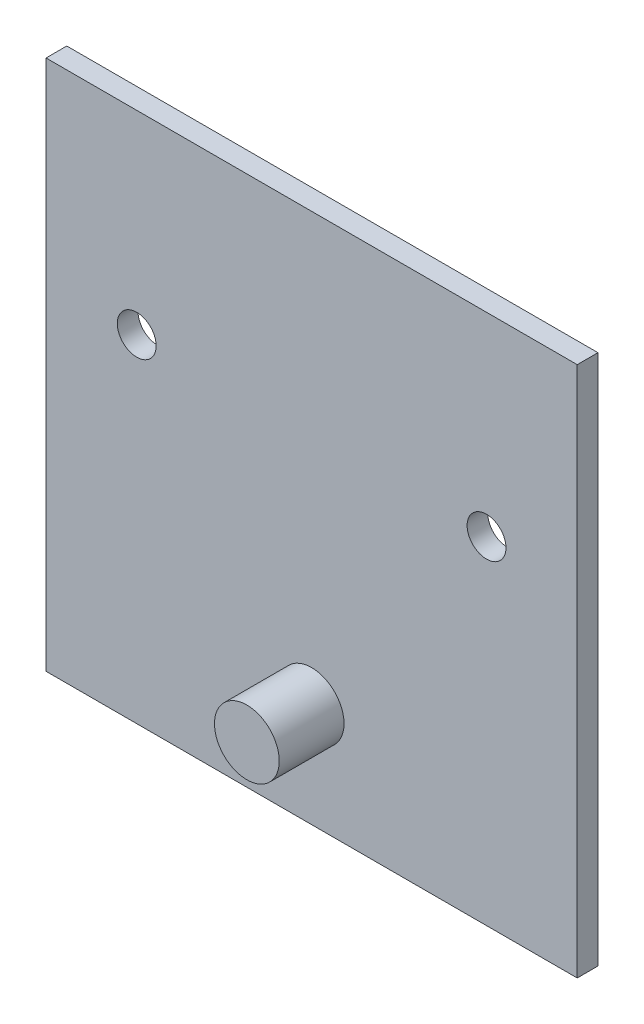
ISO-10303-21;
HEADER;
FILE_DESCRIPTION(('STEP AP214'),'2;1');
FILE_NAME('part.step','',(''),(''),'','','');
FILE_SCHEMA(('AUTOMOTIVE_DESIGN { 1 0 10303 214 1 1 1 1 }'));
ENDSEC;
DATA;
#1=APPLICATION_CONTEXT('core data for automotive mechanical design processes');
#2=APPLICATION_PROTOCOL_DEFINITION('international standard','automotive_design',2000,#1);
#3=PRODUCT_CONTEXT('',#1,'mechanical');
#4=PRODUCT('Part','Part','',(#3));
#5=PRODUCT_RELATED_PRODUCT_CATEGORY('part','',(#4));
#6=PRODUCT_DEFINITION_FORMATION('','',#4);
#7=PRODUCT_DEFINITION_CONTEXT('part definition',#1,'design');
#8=PRODUCT_DEFINITION('design','',#6,#7);
#9=PRODUCT_DEFINITION_SHAPE('','',#8);
#10=(LENGTH_UNIT() NAMED_UNIT(*) SI_UNIT(.MILLI.,.METRE.));
#11=(NAMED_UNIT(*) PLANE_ANGLE_UNIT() SI_UNIT($,.RADIAN.));
#12=(NAMED_UNIT(*) SI_UNIT($,.STERADIAN.) SOLID_ANGLE_UNIT());
#13=UNCERTAINTY_MEASURE_WITH_UNIT(LENGTH_MEASURE(1.E-05),#10,'distance_accuracy_value','');
#14=(GEOMETRIC_REPRESENTATION_CONTEXT(3) GLOBAL_UNCERTAINTY_ASSIGNED_CONTEXT((#13)) GLOBAL_UNIT_ASSIGNED_CONTEXT((#10,
#11,#12)) REPRESENTATION_CONTEXT('',''));
#15=CARTESIAN_POINT('',(0.,0.,0.));
#16=DIRECTION('',(0.,0.,1.));
#17=DIRECTION('',(1.,0.,0.));
#18=AXIS2_PLACEMENT_3D('',#15,#16,#17);
#19=CARTESIAN_POINT('',(20.5,8.00000000000001,6.6));
#20=DIRECTION('',(0.,0.,-1.));
#21=DIRECTION('',(-1.,0.,0.));
#22=AXIS2_PLACEMENT_3D('',#19,#20,#21);
#23=PLANE('',#22);
#24=CARTESIAN_POINT('',(20.5,8.00000000000001,6.6));
#25=DIRECTION('',(0.,0.,1.));
#26=DIRECTION('',(1.,0.,0.));
#27=AXIS2_PLACEMENT_3D('',#24,#25,#26);
#28=CIRCLE('',#27,2.5);
#29=CARTESIAN_POINT('',(23.,8.00000000000001,6.6));
#30=VERTEX_POINT('',#29);
#31=EDGE_CURVE('E20',#30,#30,#28,.F.);
#32=ORIENTED_EDGE('',*,*,#31,.F.);
#33=EDGE_LOOP('',(#32));
#34=FACE_BOUND('',#33,.T.);
#35=ADVANCED_FACE('F17',(#34),#23,.F.);
#36=CARTESIAN_POINT('',(20.5,8.00000000000001,1.6));
#37=DIRECTION('',(0.,0.,1.));
#38=DIRECTION('',(1.,0.,0.));
#39=AXIS2_PLACEMENT_3D('',#36,#37,#38);
#40=CYLINDRICAL_SURFACE('',#39,2.5);
#41=CARTESIAN_POINT('',(20.5,8.00000000000001,1.6));
#42=DIRECTION('',(0.,0.,1.));
#43=DIRECTION('',(1.,0.,0.));
#44=AXIS2_PLACEMENT_3D('',#41,#42,#43);
#45=CIRCLE('',#44,2.5);
#46=CARTESIAN_POINT('',(23.,8.00000000000001,1.6));
#47=VERTEX_POINT('',#46);
#48=EDGE_CURVE('E76',#47,#47,#45,.F.);
#49=ORIENTED_EDGE('',*,*,#48,.F.);
#50=EDGE_LOOP('',(#49));
#51=FACE_BOUND('',#50,.T.);
#52=ORIENTED_EDGE('',*,*,#31,.T.);
#53=EDGE_LOOP('',(#52));
#54=FACE_BOUND('',#53,.T.);
#55=ADVANCED_FACE('F100',(#51,#54),#40,.T.);
#56=CARTESIAN_POINT('',(20.5,20.5,1.6));
#57=DIRECTION('',(0.,0.,1.));
#58=DIRECTION('',(1.,0.,0.));
#59=AXIS2_PLACEMENT_3D('',#56,#57,#58);
#60=PLANE('',#59);
#61=CARTESIAN_POINT('',(7.,26.,1.6));
#62=DIRECTION('',(0.,0.,1.));
#63=DIRECTION('',(1.,0.,0.));
#64=AXIS2_PLACEMENT_3D('',#61,#62,#63);
#65=CIRCLE('',#64,1.5);
#66=CARTESIAN_POINT('',(8.5,26.,1.6));
#67=VERTEX_POINT('',#66);
#68=EDGE_CURVE('E88',#67,#67,#65,.F.);
#69=ORIENTED_EDGE('',*,*,#68,.T.);
#70=EDGE_LOOP('',(#69));
#71=FACE_BOUND('',#70,.T.);
#72=CARTESIAN_POINT('',(34.,26.,1.6));
#73=DIRECTION('',(0.,0.,1.));
#74=DIRECTION('',(1.,0.,0.));
#75=AXIS2_PLACEMENT_3D('',#72,#73,#74);
#76=CIRCLE('',#75,1.5);
#77=CARTESIAN_POINT('',(35.5,26.,1.6));
#78=VERTEX_POINT('',#77);
#79=EDGE_CURVE('E91',#78,#78,#76,.F.);
#80=ORIENTED_EDGE('',*,*,#79,.T.);
#81=EDGE_LOOP('',(#80));
#82=FACE_BOUND('',#81,.T.);
#83=ORIENTED_EDGE('',*,*,#48,.T.);
#84=EDGE_LOOP('',(#83));
#85=FACE_BOUND('',#84,.T.);
#86=DIRECTION('',(0.,1.,0.));
#87=VECTOR('',#86,1.);
#88=CARTESIAN_POINT('',(41.,41.,1.6));
#89=LINE('',#88,#87);
#90=CARTESIAN_POINT('',(41.,41.,1.6));
#91=VERTEX_POINT('',#90);
#92=CARTESIAN_POINT('',(41.,0.,1.6));
#93=VERTEX_POINT('',#92);
#94=EDGE_CURVE('E68',#91,#93,#89,.F.);
#95=ORIENTED_EDGE('',*,*,#94,.F.);
#96=DIRECTION('',(1.,0.,0.));
#97=VECTOR('',#96,1.);
#98=CARTESIAN_POINT('',(0.,41.,1.6));
#99=LINE('',#98,#97);
#100=CARTESIAN_POINT('',(0.,41.,1.6));
#101=VERTEX_POINT('',#100);
#102=EDGE_CURVE('E59',#101,#91,#99,.T.);
#103=ORIENTED_EDGE('',*,*,#102,.F.);
#104=DIRECTION('',(0.,1.,0.));
#105=VECTOR('',#104,1.);
#106=CARTESIAN_POINT('',(0.,0.,1.6));
#107=LINE('',#106,#105);
#108=CARTESIAN_POINT('',(0.,0.,1.6));
#109=VERTEX_POINT('',#108);
#110=EDGE_CURVE('E54',#109,#101,#107,.T.);
#111=ORIENTED_EDGE('',*,*,#110,.F.);
#112=DIRECTION('',(1.,0.,0.));
#113=VECTOR('',#112,1.);
#114=CARTESIAN_POINT('',(41.,0.,1.6));
#115=LINE('',#114,#113);
#116=EDGE_CURVE('E72',#93,#109,#115,.F.);
#117=ORIENTED_EDGE('',*,*,#116,.F.);
#118=EDGE_LOOP('',(#95,#103,#111,#117));
#119=FACE_BOUND('',#118,.T.);
#120=ADVANCED_FACE('F71',(#71,#82,#85,#119),#60,.T.);
#121=CARTESIAN_POINT('',(41.,41.,0.));
#122=DIRECTION('',(1.,0.,0.));
#123=DIRECTION('',(0.,0.,-1.));
#124=AXIS2_PLACEMENT_3D('',#121,#122,#123);
#125=PLANE('',#124);
#126=DIRECTION('',(0.,1.,0.));
#127=VECTOR('',#126,1.);
#128=CARTESIAN_POINT('',(41.,20.5,0.));
#129=LINE('',#128,#127);
#130=CARTESIAN_POINT('',(41.,0.,0.));
#131=VERTEX_POINT('',#130);
#132=CARTESIAN_POINT('',(41.,41.,0.));
#133=VERTEX_POINT('',#132);
#134=EDGE_CURVE('E80',#131,#133,#129,.T.);
#135=ORIENTED_EDGE('',*,*,#134,.T.);
#136=DIRECTION('',(0.,0.,1.));
#137=VECTOR('',#136,1.);
#138=CARTESIAN_POINT('',(41.,41.,0.));
#139=LINE('',#138,#137);
#140=EDGE_CURVE('E64',#91,#133,#139,.F.);
#141=ORIENTED_EDGE('',*,*,#140,.F.);
#142=ORIENTED_EDGE('',*,*,#94,.T.);
#143=DIRECTION('',(0.,0.,-1.));
#144=VECTOR('',#143,1.);
#145=CARTESIAN_POINT('',(41.,0.,0.));
#146=LINE('',#145,#144);
#147=EDGE_CURVE('E93',#131,#93,#146,.F.);
#148=ORIENTED_EDGE('',*,*,#147,.F.);
#149=EDGE_LOOP('',(#135,#141,#142,#148));
#150=FACE_BOUND('',#149,.T.);
#151=ADVANCED_FACE('F79',(#150),#125,.T.);
#152=CARTESIAN_POINT('',(0.,41.,0.));
#153=DIRECTION('',(0.,1.,0.));
#154=DIRECTION('',(0.,0.,1.));
#155=AXIS2_PLACEMENT_3D('',#152,#153,#154);
#156=PLANE('',#155);
#157=DIRECTION('',(1.,0.,0.));
#158=VECTOR('',#157,1.);
#159=CARTESIAN_POINT('',(20.5,41.,0.));
#160=LINE('',#159,#158);
#161=CARTESIAN_POINT('',(0.,41.,0.));
#162=VERTEX_POINT('',#161);
#163=EDGE_CURVE('E148',#133,#162,#160,.F.);
#164=ORIENTED_EDGE('',*,*,#163,.T.);
#165=DIRECTION('',(0.,0.,1.));
#166=VECTOR('',#165,1.);
#167=CARTESIAN_POINT('',(0.,41.,0.));
#168=LINE('',#167,#166);
#169=EDGE_CURVE('E66',#101,#162,#168,.F.);
#170=ORIENTED_EDGE('',*,*,#169,.F.);
#171=ORIENTED_EDGE('',*,*,#102,.T.);
#172=ORIENTED_EDGE('',*,*,#140,.T.);
#173=EDGE_LOOP('',(#164,#170,#171,#172));
#174=FACE_BOUND('',#173,.T.);
#175=ADVANCED_FACE('F62',(#174),#156,.T.);
#176=CARTESIAN_POINT('',(0.,0.,0.));
#177=DIRECTION('',(-1.,0.,0.));
#178=DIRECTION('',(0.,0.,1.));
#179=AXIS2_PLACEMENT_3D('',#176,#177,#178);
#180=PLANE('',#179);
#181=DIRECTION('',(0.,1.,0.));
#182=VECTOR('',#181,1.);
#183=CARTESIAN_POINT('',(0.,20.5,0.));
#184=LINE('',#183,#182);
#185=CARTESIAN_POINT('',(0.,0.,0.));
#186=VERTEX_POINT('',#185);
#187=EDGE_CURVE('E147',#162,#186,#184,.F.);
#188=ORIENTED_EDGE('',*,*,#187,.T.);
#189=DIRECTION('',(0.,0.,-1.));
#190=VECTOR('',#189,1.);
#191=CARTESIAN_POINT('',(0.,0.,0.));
#192=LINE('',#191,#190);
#193=EDGE_CURVE('E35',#109,#186,#192,.T.);
#194=ORIENTED_EDGE('',*,*,#193,.F.);
#195=ORIENTED_EDGE('',*,*,#110,.T.);
#196=ORIENTED_EDGE('',*,*,#169,.T.);
#197=EDGE_LOOP('',(#188,#194,#195,#196));
#198=FACE_BOUND('',#197,.T.);
#199=ADVANCED_FACE('F128',(#198),#180,.T.);
#200=CARTESIAN_POINT('',(41.,0.,0.));
#201=DIRECTION('',(0.,-1.,0.));
#202=DIRECTION('',(0.,0.,-1.));
#203=AXIS2_PLACEMENT_3D('',#200,#201,#202);
#204=PLANE('',#203);
#205=DIRECTION('',(1.,0.,0.));
#206=VECTOR('',#205,1.);
#207=CARTESIAN_POINT('',(20.5,0.,0.));
#208=LINE('',#207,#206);
#209=EDGE_CURVE('E87',#186,#131,#208,.T.);
#210=ORIENTED_EDGE('',*,*,#209,.T.);
#211=ORIENTED_EDGE('',*,*,#147,.T.);
#212=ORIENTED_EDGE('',*,*,#116,.T.);
#213=ORIENTED_EDGE('',*,*,#193,.T.);
#214=EDGE_LOOP('',(#210,#211,#212,#213));
#215=FACE_BOUND('',#214,.T.);
#216=ADVANCED_FACE('F124',(#215),#204,.T.);
#217=CARTESIAN_POINT('',(34.,26.,-2.4));
#218=DIRECTION('',(0.,0.,1.));
#219=DIRECTION('',(1.,0.,0.));
#220=AXIS2_PLACEMENT_3D('',#217,#218,#219);
#221=CYLINDRICAL_SURFACE('',#220,1.5);
#222=ORIENTED_EDGE('',*,*,#79,.F.);
#223=EDGE_LOOP('',(#222));
#224=FACE_BOUND('',#223,.T.);
#225=CARTESIAN_POINT('',(34.,26.,0.));
#226=DIRECTION('',(0.,0.,1.));
#227=DIRECTION('',(1.,0.,0.));
#228=AXIS2_PLACEMENT_3D('',#225,#226,#227);
#229=CIRCLE('',#228,1.5);
#230=CARTESIAN_POINT('',(35.5,26.,0.));
#231=VERTEX_POINT('',#230);
#232=EDGE_CURVE('E26',#231,#231,#229,.F.);
#233=ORIENTED_EDGE('',*,*,#232,.T.);
#234=EDGE_LOOP('',(#233));
#235=FACE_BOUND('',#234,.T.);
#236=ADVANCED_FACE('F116',(#224,#235),#221,.F.);
#237=CARTESIAN_POINT('',(7.,26.,-2.4));
#238=DIRECTION('',(0.,0.,1.));
#239=DIRECTION('',(1.,0.,0.));
#240=AXIS2_PLACEMENT_3D('',#237,#238,#239);
#241=CYLINDRICAL_SURFACE('',#240,1.5);
#242=ORIENTED_EDGE('',*,*,#68,.F.);
#243=EDGE_LOOP('',(#242));
#244=FACE_BOUND('',#243,.T.);
#245=CARTESIAN_POINT('',(7.,26.,0.));
#246=DIRECTION('',(0.,0.,1.));
#247=DIRECTION('',(1.,0.,0.));
#248=AXIS2_PLACEMENT_3D('',#245,#246,#247);
#249=CIRCLE('',#248,1.5);
#250=CARTESIAN_POINT('',(8.5,26.,0.));
#251=VERTEX_POINT('',#250);
#252=EDGE_CURVE('E11',#251,#251,#249,.F.);
#253=ORIENTED_EDGE('',*,*,#252,.T.);
#254=EDGE_LOOP('',(#253));
#255=FACE_BOUND('',#254,.T.);
#256=ADVANCED_FACE('F110',(#244,#255),#241,.F.);
#257=CARTESIAN_POINT('',(20.5,20.5,0.));
#258=DIRECTION('',(0.,0.,1.));
#259=DIRECTION('',(1.,0.,0.));
#260=AXIS2_PLACEMENT_3D('',#257,#258,#259);
#261=PLANE('',#260);
#262=ORIENTED_EDGE('',*,*,#252,.F.);
#263=EDGE_LOOP('',(#262));
#264=FACE_BOUND('',#263,.T.);
#265=ORIENTED_EDGE('',*,*,#232,.F.);
#266=EDGE_LOOP('',(#265));
#267=FACE_BOUND('',#266,.T.);
#268=ORIENTED_EDGE('',*,*,#187,.F.);
#269=ORIENTED_EDGE('',*,*,#163,.F.);
#270=ORIENTED_EDGE('',*,*,#134,.F.);
#271=ORIENTED_EDGE('',*,*,#209,.F.);
#272=EDGE_LOOP('',(#268,#269,#270,#271));
#273=FACE_BOUND('',#272,.T.);
#274=ADVANCED_FACE('F108',(#264,#267,#273),#261,.F.);
#275=CLOSED_SHELL('',(#35,#55,#120,#151,#175,#199,#216,#236,#256,#274));
#276=MANIFOLD_SOLID_BREP('B1',#275);
#277=ADVANCED_BREP_SHAPE_REPRESENTATION('',(#18,#276),#14);
#278=SHAPE_DEFINITION_REPRESENTATION(#9,#277);
ENDSEC;
END-ISO-10303-21;
